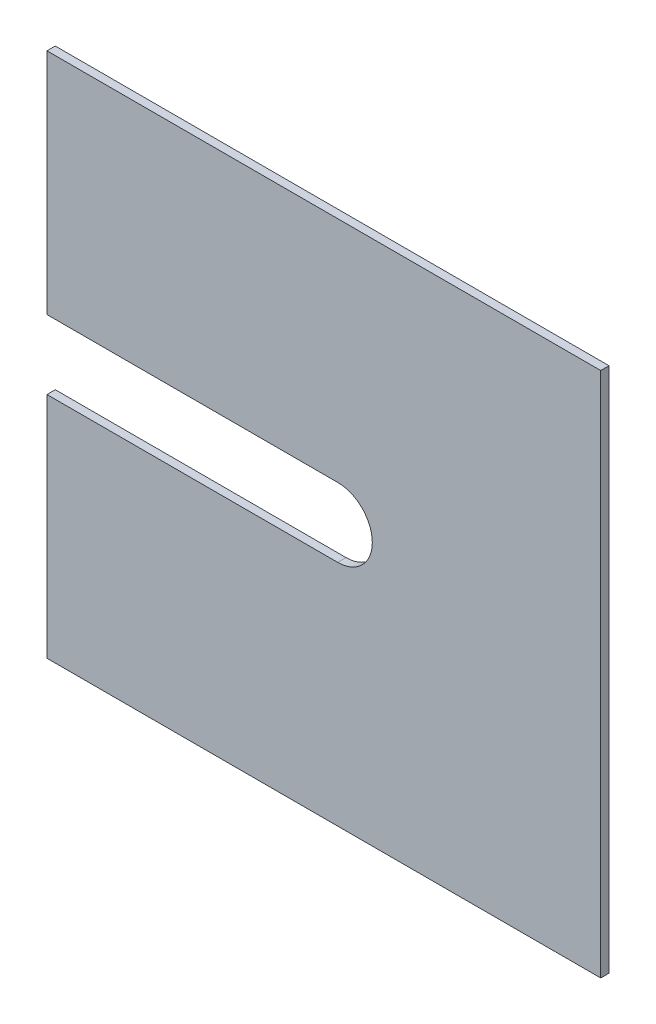
ISO-10303-21;
HEADER;
FILE_DESCRIPTION(('STEP AP214'),'2;1');
FILE_NAME('part.step','',(''),(''),'','','');
FILE_SCHEMA(('AUTOMOTIVE_DESIGN { 1 0 10303 214 1 1 1 1 }'));
ENDSEC;
DATA;
#1=APPLICATION_CONTEXT('core data for automotive mechanical design processes');
#2=APPLICATION_PROTOCOL_DEFINITION('international standard','automotive_design',2000,#1);
#3=PRODUCT_CONTEXT('',#1,'mechanical');
#4=PRODUCT('Part','Part','',(#3));
#5=PRODUCT_RELATED_PRODUCT_CATEGORY('part','',(#4));
#6=PRODUCT_DEFINITION_FORMATION('','',#4);
#7=PRODUCT_DEFINITION_CONTEXT('part definition',#1,'design');
#8=PRODUCT_DEFINITION('design','',#6,#7);
#9=PRODUCT_DEFINITION_SHAPE('','',#8);
#10=(LENGTH_UNIT() NAMED_UNIT(*) SI_UNIT(.MILLI.,.METRE.));
#11=(NAMED_UNIT(*) PLANE_ANGLE_UNIT() SI_UNIT($,.RADIAN.));
#12=(NAMED_UNIT(*) SI_UNIT($,.STERADIAN.) SOLID_ANGLE_UNIT());
#13=UNCERTAINTY_MEASURE_WITH_UNIT(LENGTH_MEASURE(1.E-05),#10,'distance_accuracy_value','');
#14=(GEOMETRIC_REPRESENTATION_CONTEXT(3) GLOBAL_UNCERTAINTY_ASSIGNED_CONTEXT((#13)) GLOBAL_UNIT_ASSIGNED_CONTEXT((#10,
#11,#12)) REPRESENTATION_CONTEXT('',''));
#15=CARTESIAN_POINT('',(0.,0.,0.));
#16=DIRECTION('',(0.,0.,1.));
#17=DIRECTION('',(1.,0.,0.));
#18=AXIS2_PLACEMENT_3D('',#15,#16,#17);
#19=CARTESIAN_POINT('',(-100.,-95.,3.));
#20=DIRECTION('',(1.,0.,0.));
#21=DIRECTION('',(0.,0.,-1.));
#22=AXIS2_PLACEMENT_3D('',#19,#20,#21);
#23=PLANE('',#22);
#24=DIRECTION('',(0.,-1.,0.));
#25=VECTOR('',#24,1.);
#26=CARTESIAN_POINT('',(-100.,-95.,3.));
#27=LINE('',#26,#25);
#28=CARTESIAN_POINT('',(-100.,-12.5,3.));
#29=VERTEX_POINT('',#28);
#30=CARTESIAN_POINT('',(-100.,-95.,3.));
#31=VERTEX_POINT('',#30);
#32=EDGE_CURVE('E154',#29,#31,#27,.T.);
#33=ORIENTED_EDGE('',*,*,#32,.F.);
#34=DIRECTION('',(0.,0.,1.));
#35=VECTOR('',#34,1.);
#36=CARTESIAN_POINT('',(-100.,-12.5,0.));
#37=LINE('',#36,#35);
#38=CARTESIAN_POINT('',(-100.,-12.5,0.));
#39=VERTEX_POINT('',#38);
#40=EDGE_CURVE('E148',#39,#29,#37,.T.);
#41=ORIENTED_EDGE('',*,*,#40,.F.);
#42=DIRECTION('',(0.,-1.,0.));
#43=VECTOR('',#42,1.);
#44=CARTESIAN_POINT('',(-100.,-95.,0.));
#45=LINE('',#44,#43);
#46=CARTESIAN_POINT('',(-100.,-95.,0.));
#47=VERTEX_POINT('',#46);
#48=EDGE_CURVE('E164',#39,#47,#45,.T.);
#49=ORIENTED_EDGE('',*,*,#48,.T.);
#50=DIRECTION('',(0.,0.,-1.));
#51=VECTOR('',#50,1.);
#52=CARTESIAN_POINT('',(-100.,-95.,3.));
#53=LINE('',#52,#51);
#54=EDGE_CURVE('E169',#31,#47,#53,.T.);
#55=ORIENTED_EDGE('',*,*,#54,.F.);
#56=EDGE_LOOP('',(#33,#41,#49,#55));
#57=FACE_BOUND('',#56,.T.);
#58=ADVANCED_FACE('F43',(#57),#23,.F.);
#59=CARTESIAN_POINT('',(100.,-95.,3.));
#60=DIRECTION('',(-1.,0.,0.));
#61=DIRECTION('',(0.,0.,1.));
#62=AXIS2_PLACEMENT_3D('',#59,#60,#61);
#63=PLANE('',#62);
#64=DIRECTION('',(0.,1.,0.));
#65=VECTOR('',#64,1.);
#66=CARTESIAN_POINT('',(100.,-95.,0.));
#67=LINE('',#66,#65);
#68=CARTESIAN_POINT('',(100.,-95.,0.));
#69=VERTEX_POINT('',#68);
#70=CARTESIAN_POINT('',(100.,95.,0.));
#71=VERTEX_POINT('',#70);
#72=EDGE_CURVE('E147',#69,#71,#67,.T.);
#73=ORIENTED_EDGE('',*,*,#72,.T.);
#74=DIRECTION('',(0.,0.,-1.));
#75=VECTOR('',#74,1.);
#76=CARTESIAN_POINT('',(100.,95.,3.));
#77=LINE('',#76,#75);
#78=CARTESIAN_POINT('',(100.,95.,3.));
#79=VERTEX_POINT('',#78);
#80=EDGE_CURVE('E11',#79,#71,#77,.T.);
#81=ORIENTED_EDGE('',*,*,#80,.F.);
#82=DIRECTION('',(0.,1.,0.));
#83=VECTOR('',#82,1.);
#84=CARTESIAN_POINT('',(100.,-95.,3.));
#85=LINE('',#84,#83);
#86=CARTESIAN_POINT('',(100.,-95.,3.));
#87=VERTEX_POINT('',#86);
#88=EDGE_CURVE('E151',#87,#79,#85,.T.);
#89=ORIENTED_EDGE('',*,*,#88,.F.);
#90=DIRECTION('',(0.,0.,-1.));
#91=VECTOR('',#90,1.);
#92=CARTESIAN_POINT('',(100.,-95.,3.));
#93=LINE('',#92,#91);
#94=EDGE_CURVE('E159',#87,#69,#93,.T.);
#95=ORIENTED_EDGE('',*,*,#94,.T.);
#96=EDGE_LOOP('',(#73,#81,#89,#95));
#97=FACE_BOUND('',#96,.T.);
#98=ADVANCED_FACE('F45',(#97),#63,.F.);
#99=CARTESIAN_POINT('',(-100.,95.,3.));
#100=DIRECTION('',(0.,-1.,0.));
#101=DIRECTION('',(0.,0.,-1.));
#102=AXIS2_PLACEMENT_3D('',#99,#100,#101);
#103=PLANE('',#102);
#104=DIRECTION('',(-1.,0.,0.));
#105=VECTOR('',#104,1.);
#106=CARTESIAN_POINT('',(-100.,95.,0.));
#107=LINE('',#106,#105);
#108=CARTESIAN_POINT('',(-100.,95.,0.));
#109=VERTEX_POINT('',#108);
#110=EDGE_CURVE('E162',#71,#109,#107,.T.);
#111=ORIENTED_EDGE('',*,*,#110,.T.);
#112=DIRECTION('',(0.,0.,-1.));
#113=VECTOR('',#112,1.);
#114=CARTESIAN_POINT('',(-100.,95.,3.));
#115=LINE('',#114,#113);
#116=CARTESIAN_POINT('',(-100.,95.,3.));
#117=VERTEX_POINT('',#116);
#118=EDGE_CURVE('E51',#117,#109,#115,.T.);
#119=ORIENTED_EDGE('',*,*,#118,.F.);
#120=DIRECTION('',(-1.,0.,0.));
#121=VECTOR('',#120,1.);
#122=CARTESIAN_POINT('',(-100.,95.,3.));
#123=LINE('',#122,#121);
#124=EDGE_CURVE('E95',#79,#117,#123,.T.);
#125=ORIENTED_EDGE('',*,*,#124,.F.);
#126=ORIENTED_EDGE('',*,*,#80,.T.);
#127=EDGE_LOOP('',(#111,#119,#125,#126));
#128=FACE_BOUND('',#127,.T.);
#129=ADVANCED_FACE('F176',(#128),#103,.F.);
#130=CARTESIAN_POINT('',(-100.,12.5,0.));
#131=VERTEX_POINT('',#130);
#132=EDGE_CURVE('E165',#109,#131,#45,.T.);
#133=ORIENTED_EDGE('',*,*,#132,.T.);
#134=DIRECTION('',(0.,0.,1.));
#135=VECTOR('',#134,1.);
#136=CARTESIAN_POINT('',(-100.,12.5,0.));
#137=LINE('',#136,#135);
#138=CARTESIAN_POINT('',(-100.,12.5,3.));
#139=VERTEX_POINT('',#138);
#140=EDGE_CURVE('E58',#131,#139,#137,.T.);
#141=ORIENTED_EDGE('',*,*,#140,.T.);
#142=EDGE_CURVE('E155',#117,#139,#27,.T.);
#143=ORIENTED_EDGE('',*,*,#142,.F.);
#144=ORIENTED_EDGE('',*,*,#118,.T.);
#145=EDGE_LOOP('',(#133,#141,#143,#144));
#146=FACE_BOUND('',#145,.T.);
#147=ADVANCED_FACE('F173',(#146),#23,.F.);
#148=CARTESIAN_POINT('',(-100.,-95.,3.));
#149=DIRECTION('',(0.,1.,0.));
#150=DIRECTION('',(0.,0.,1.));
#151=AXIS2_PLACEMENT_3D('',#148,#149,#150);
#152=PLANE('',#151);
#153=DIRECTION('',(1.,0.,0.));
#154=VECTOR('',#153,1.);
#155=CARTESIAN_POINT('',(-100.,-95.,0.));
#156=LINE('',#155,#154);
#157=EDGE_CURVE('E88',#47,#69,#156,.T.);
#158=ORIENTED_EDGE('',*,*,#157,.T.);
#159=ORIENTED_EDGE('',*,*,#94,.F.);
#160=DIRECTION('',(1.,0.,0.));
#161=VECTOR('',#160,1.);
#162=CARTESIAN_POINT('',(-100.,-95.,3.));
#163=LINE('',#162,#161);
#164=EDGE_CURVE('E67',#31,#87,#163,.T.);
#165=ORIENTED_EDGE('',*,*,#164,.F.);
#166=ORIENTED_EDGE('',*,*,#54,.T.);
#167=EDGE_LOOP('',(#158,#159,#165,#166));
#168=FACE_BOUND('',#167,.T.);
#169=ADVANCED_FACE('F179',(#168),#152,.F.);
#170=CARTESIAN_POINT('',(0.,0.,3.));
#171=DIRECTION('',(0.,0.,-1.));
#172=DIRECTION('',(-1.,0.,0.));
#173=AXIS2_PLACEMENT_3D('',#170,#171,#172);
#174=PLANE('',#173);
#175=CARTESIAN_POINT('',(5.00000000000002,0.,3.));
#176=DIRECTION('',(0.,0.,1.));
#177=DIRECTION('',(1.,0.,0.));
#178=AXIS2_PLACEMENT_3D('',#175,#176,#177);
#179=CIRCLE('',#178,12.5);
#180=CARTESIAN_POINT('',(5.00000000000002,-12.5,3.));
#181=VERTEX_POINT('',#180);
#182=CARTESIAN_POINT('',(5.00000000000002,12.5,3.));
#183=VERTEX_POINT('',#182);
#184=EDGE_CURVE('E124',#181,#183,#179,.T.);
#185=ORIENTED_EDGE('',*,*,#184,.F.);
#186=DIRECTION('',(1.,0.,0.));
#187=VECTOR('',#186,1.);
#188=CARTESIAN_POINT('',(-100.,-12.5,3.));
#189=LINE('',#188,#187);
#190=EDGE_CURVE('E136',#29,#181,#189,.T.);
#191=ORIENTED_EDGE('',*,*,#190,.F.);
#192=ORIENTED_EDGE('',*,*,#32,.T.);
#193=ORIENTED_EDGE('',*,*,#164,.T.);
#194=ORIENTED_EDGE('',*,*,#88,.T.);
#195=ORIENTED_EDGE('',*,*,#124,.T.);
#196=ORIENTED_EDGE('',*,*,#142,.T.);
#197=DIRECTION('',(-1.,0.,0.));
#198=VECTOR('',#197,1.);
#199=CARTESIAN_POINT('',(5.00000000000002,12.5,3.));
#200=LINE('',#199,#198);
#201=EDGE_CURVE('E139',#183,#139,#200,.T.);
#202=ORIENTED_EDGE('',*,*,#201,.F.);
#203=EDGE_LOOP('',(#185,#191,#192,#193,#194,#195,#196,#202));
#204=FACE_BOUND('',#203,.T.);
#205=ADVANCED_FACE('F187',(#204),#174,.F.);
#206=CARTESIAN_POINT('',(0.,0.,0.));
#207=DIRECTION('',(0.,0.,-1.));
#208=DIRECTION('',(-1.,0.,0.));
#209=AXIS2_PLACEMENT_3D('',#206,#207,#208);
#210=PLANE('',#209);
#211=DIRECTION('',(1.,0.,0.));
#212=VECTOR('',#211,1.);
#213=CARTESIAN_POINT('',(-100.,-12.5,0.));
#214=LINE('',#213,#212);
#215=CARTESIAN_POINT('',(5.00000000000002,-12.5,0.));
#216=VERTEX_POINT('',#215);
#217=EDGE_CURVE('E126',#39,#216,#214,.T.);
#218=ORIENTED_EDGE('',*,*,#217,.T.);
#219=CARTESIAN_POINT('',(5.00000000000002,0.,0.));
#220=DIRECTION('',(0.,0.,1.));
#221=DIRECTION('',(1.,0.,0.));
#222=AXIS2_PLACEMENT_3D('',#219,#220,#221);
#223=CIRCLE('',#222,12.5);
#224=CARTESIAN_POINT('',(5.00000000000002,12.5,0.));
#225=VERTEX_POINT('',#224);
#226=EDGE_CURVE('E121',#216,#225,#223,.T.);
#227=ORIENTED_EDGE('',*,*,#226,.T.);
#228=DIRECTION('',(-1.,0.,0.));
#229=VECTOR('',#228,1.);
#230=CARTESIAN_POINT('',(5.00000000000002,12.5,0.));
#231=LINE('',#230,#229);
#232=EDGE_CURVE('E128',#225,#131,#231,.T.);
#233=ORIENTED_EDGE('',*,*,#232,.T.);
#234=ORIENTED_EDGE('',*,*,#132,.F.);
#235=ORIENTED_EDGE('',*,*,#110,.F.);
#236=ORIENTED_EDGE('',*,*,#72,.F.);
#237=ORIENTED_EDGE('',*,*,#157,.F.);
#238=ORIENTED_EDGE('',*,*,#48,.F.);
#239=EDGE_LOOP('',(#218,#227,#233,#234,#235,#236,#237,#238));
#240=FACE_BOUND('',#239,.T.);
#241=ADVANCED_FACE('F134',(#240),#210,.T.);
#242=CARTESIAN_POINT('',(5.00000000000002,0.,0.));
#243=DIRECTION('',(0.,0.,1.));
#244=DIRECTION('',(1.,0.,0.));
#245=AXIS2_PLACEMENT_3D('',#242,#243,#244);
#246=CYLINDRICAL_SURFACE('',#245,12.5);
#247=ORIENTED_EDGE('',*,*,#184,.T.);
#248=DIRECTION('',(0.,0.,1.));
#249=VECTOR('',#248,1.);
#250=CARTESIAN_POINT('',(5.00000000000002,12.5,0.));
#251=LINE('',#250,#249);
#252=EDGE_CURVE('E118',#225,#183,#251,.T.);
#253=ORIENTED_EDGE('',*,*,#252,.F.);
#254=ORIENTED_EDGE('',*,*,#226,.F.);
#255=DIRECTION('',(0.,0.,1.));
#256=VECTOR('',#255,1.);
#257=CARTESIAN_POINT('',(5.00000000000002,-12.5,0.));
#258=LINE('',#257,#256);
#259=EDGE_CURVE('E145',#216,#181,#258,.T.);
#260=ORIENTED_EDGE('',*,*,#259,.T.);
#261=EDGE_LOOP('',(#247,#253,#254,#260));
#262=FACE_BOUND('',#261,.T.);
#263=ADVANCED_FACE('F119',(#262),#246,.F.);
#264=CARTESIAN_POINT('',(-100.,-12.5,0.));
#265=DIRECTION('',(0.,-1.,0.));
#266=DIRECTION('',(1.,0.,0.));
#267=AXIS2_PLACEMENT_3D('',#264,#265,#266);
#268=PLANE('',#267);
#269=ORIENTED_EDGE('',*,*,#190,.T.);
#270=ORIENTED_EDGE('',*,*,#259,.F.);
#271=ORIENTED_EDGE('',*,*,#217,.F.);
#272=ORIENTED_EDGE('',*,*,#40,.T.);
#273=EDGE_LOOP('',(#269,#270,#271,#272));
#274=FACE_BOUND('',#273,.T.);
#275=ADVANCED_FACE('F186',(#274),#268,.F.);
#276=CARTESIAN_POINT('',(5.00000000000002,12.5,0.));
#277=DIRECTION('',(0.,1.,0.));
#278=DIRECTION('',(-1.,0.,0.));
#279=AXIS2_PLACEMENT_3D('',#276,#277,#278);
#280=PLANE('',#279);
#281=ORIENTED_EDGE('',*,*,#201,.T.);
#282=ORIENTED_EDGE('',*,*,#140,.F.);
#283=ORIENTED_EDGE('',*,*,#232,.F.);
#284=ORIENTED_EDGE('',*,*,#252,.T.);
#285=EDGE_LOOP('',(#281,#282,#283,#284));
#286=FACE_BOUND('',#285,.T.);
#287=ADVANCED_FACE('F129',(#286),#280,.F.);
#288=CLOSED_SHELL('',(#58,#98,#129,#147,#169,#205,#241,#263,#275,#287));
#289=MANIFOLD_SOLID_BREP('B2',#288);
#290=ADVANCED_BREP_SHAPE_REPRESENTATION('',(#18,#289),#14);
#291=SHAPE_DEFINITION_REPRESENTATION(#9,#290);
ENDSEC;
END-ISO-10303-21;
